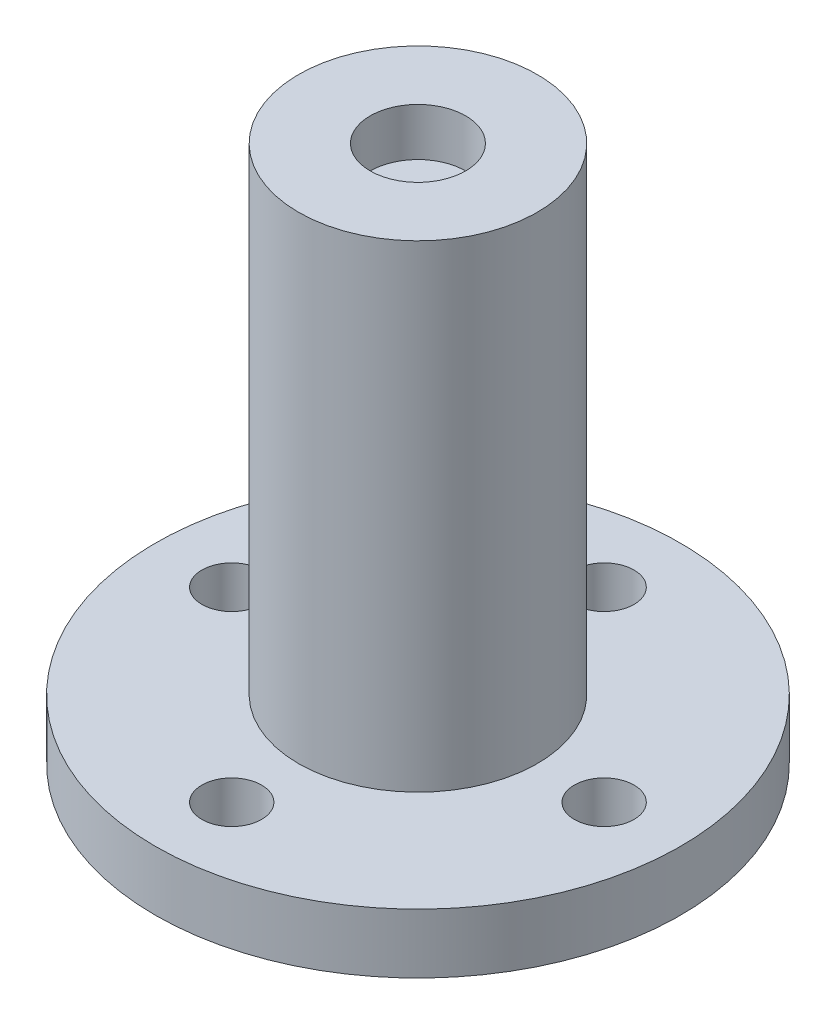
ISO-10303-21;
HEADER;
FILE_DESCRIPTION(('STEP AP214'),'2;1');
FILE_NAME('part.step','',(''),(''),'','','');
FILE_SCHEMA(('AUTOMOTIVE_DESIGN { 1 0 10303 214 1 1 1 1 }'));
ENDSEC;
DATA;
#1=APPLICATION_CONTEXT('core data for automotive mechanical design processes');
#2=APPLICATION_PROTOCOL_DEFINITION('international standard','automotive_design',2000,#1);
#3=PRODUCT_CONTEXT('',#1,'mechanical');
#4=PRODUCT('Part','Part','',(#3));
#5=PRODUCT_RELATED_PRODUCT_CATEGORY('part','',(#4));
#6=PRODUCT_DEFINITION_FORMATION('','',#4);
#7=PRODUCT_DEFINITION_CONTEXT('part definition',#1,'design');
#8=PRODUCT_DEFINITION('design','',#6,#7);
#9=PRODUCT_DEFINITION_SHAPE('','',#8);
#10=(LENGTH_UNIT() NAMED_UNIT(*) SI_UNIT(.MILLI.,.METRE.));
#11=(NAMED_UNIT(*) PLANE_ANGLE_UNIT() SI_UNIT($,.RADIAN.));
#12=(NAMED_UNIT(*) SI_UNIT($,.STERADIAN.) SOLID_ANGLE_UNIT());
#13=UNCERTAINTY_MEASURE_WITH_UNIT(LENGTH_MEASURE(1.E-05),#10,'distance_accuracy_value','');
#14=(GEOMETRIC_REPRESENTATION_CONTEXT(3) GLOBAL_UNCERTAINTY_ASSIGNED_CONTEXT((#13)) GLOBAL_UNIT_ASSIGNED_CONTEXT((#10,
#11,#12)) REPRESENTATION_CONTEXT('',''));
#15=CARTESIAN_POINT('',(0.,0.,0.));
#16=DIRECTION('',(0.,0.,1.));
#17=DIRECTION('',(1.,0.,0.));
#18=AXIS2_PLACEMENT_3D('',#15,#16,#17);
#19=CARTESIAN_POINT('',(0.,2.5,0.));
#20=DIRECTION('',(0.,1.,0.));
#21=DIRECTION('',(0.,0.,1.));
#22=AXIS2_PLACEMENT_3D('',#19,#20,#21);
#23=PLANE('',#22);
#24=CARTESIAN_POINT('',(0.,2.5,0.));
#25=DIRECTION('',(0.,1.,0.));
#26=DIRECTION('',(0.,0.,1.));
#27=AXIS2_PLACEMENT_3D('',#24,#25,#26);
#28=CIRCLE('',#27,5.);
#29=CARTESIAN_POINT('',(0.,2.5,5.));
#30=VERTEX_POINT('',#29);
#31=EDGE_CURVE('E70',#30,#30,#28,.T.);
#32=ORIENTED_EDGE('',*,*,#31,.F.);
#33=EDGE_LOOP('',(#32));
#34=FACE_BOUND('',#33,.T.);
#35=CARTESIAN_POINT('',(7.8,2.5,0.));
#36=DIRECTION('',(0.,1.,0.));
#37=DIRECTION('',(0.,0.,1.));
#38=AXIS2_PLACEMENT_3D('',#35,#36,#37);
#39=CIRCLE('',#38,1.25);
#40=CARTESIAN_POINT('',(7.8,2.5,1.25));
#41=VERTEX_POINT('',#40);
#42=EDGE_CURVE('E58',#41,#41,#39,.T.);
#43=ORIENTED_EDGE('',*,*,#42,.F.);
#44=EDGE_LOOP('',(#43));
#45=FACE_BOUND('',#44,.T.);
#46=CARTESIAN_POINT('',(-7.8,2.5,0.));
#47=DIRECTION('',(0.,1.,0.));
#48=DIRECTION('',(0.,0.,1.));
#49=AXIS2_PLACEMENT_3D('',#46,#47,#48);
#50=CIRCLE('',#49,1.25);
#51=CARTESIAN_POINT('',(-7.8,2.5,1.25));
#52=VERTEX_POINT('',#51);
#53=EDGE_CURVE('E47',#52,#52,#50,.T.);
#54=ORIENTED_EDGE('',*,*,#53,.F.);
#55=EDGE_LOOP('',(#54));
#56=FACE_BOUND('',#55,.T.);
#57=CARTESIAN_POINT('',(0.,2.5,0.));
#58=DIRECTION('',(0.,1.,0.));
#59=DIRECTION('',(0.,0.,1.));
#60=AXIS2_PLACEMENT_3D('',#57,#58,#59);
#61=CIRCLE('',#60,11.);
#62=CARTESIAN_POINT('',(0.,2.5,11.));
#63=VERTEX_POINT('',#62);
#64=EDGE_CURVE('E38',#63,#63,#61,.T.);
#65=ORIENTED_EDGE('',*,*,#64,.T.);
#66=EDGE_LOOP('',(#65));
#67=FACE_BOUND('',#66,.T.);
#68=CARTESIAN_POINT('',(0.,2.5,-7.8));
#69=DIRECTION('',(0.,1.,0.));
#70=DIRECTION('',(0.,0.,1.));
#71=AXIS2_PLACEMENT_3D('',#68,#69,#70);
#72=CIRCLE('',#71,1.25);
#73=CARTESIAN_POINT('',(0.,2.5,-6.55));
#74=VERTEX_POINT('',#73);
#75=EDGE_CURVE('E52',#74,#74,#72,.T.);
#76=ORIENTED_EDGE('',*,*,#75,.F.);
#77=EDGE_LOOP('',(#76));
#78=FACE_BOUND('',#77,.T.);
#79=CARTESIAN_POINT('',(0.,2.5,7.8));
#80=DIRECTION('',(0.,1.,0.));
#81=DIRECTION('',(0.,0.,1.));
#82=AXIS2_PLACEMENT_3D('',#79,#80,#81);
#83=CIRCLE('',#82,1.25);
#84=CARTESIAN_POINT('',(0.,2.5,9.05));
#85=VERTEX_POINT('',#84);
#86=EDGE_CURVE('E64',#85,#85,#83,.T.);
#87=ORIENTED_EDGE('',*,*,#86,.F.);
#88=EDGE_LOOP('',(#87));
#89=FACE_BOUND('',#88,.T.);
#90=ADVANCED_FACE('F31',(#34,#45,#56,#67,#78,#89),#23,.T.);
#91=CARTESIAN_POINT('',(0.,0.,0.));
#92=DIRECTION('',(0.,1.,0.));
#93=DIRECTION('',(0.,0.,1.));
#94=AXIS2_PLACEMENT_3D('',#91,#92,#93);
#95=PLANE('',#94);
#96=CARTESIAN_POINT('',(0.,0.,0.));
#97=DIRECTION('',(0.,1.,0.));
#98=DIRECTION('',(0.,0.,1.));
#99=AXIS2_PLACEMENT_3D('',#96,#97,#98);
#100=CIRCLE('',#99,11.);
#101=CARTESIAN_POINT('',(0.,0.,11.));
#102=VERTEX_POINT('',#101);
#103=EDGE_CURVE('E42',#102,#102,#100,.T.);
#104=ORIENTED_EDGE('',*,*,#103,.F.);
#105=EDGE_LOOP('',(#104));
#106=FACE_BOUND('',#105,.T.);
#107=CARTESIAN_POINT('',(-7.8,0.,0.));
#108=DIRECTION('',(0.,1.,0.));
#109=DIRECTION('',(0.,0.,1.));
#110=AXIS2_PLACEMENT_3D('',#107,#108,#109);
#111=CIRCLE('',#110,1.25);
#112=CARTESIAN_POINT('',(-7.8,0.,1.25));
#113=VERTEX_POINT('',#112);
#114=EDGE_CURVE('E49',#113,#113,#111,.T.);
#115=ORIENTED_EDGE('',*,*,#114,.T.);
#116=EDGE_LOOP('',(#115));
#117=FACE_BOUND('',#116,.T.);
#118=CARTESIAN_POINT('',(0.,0.,-7.8));
#119=DIRECTION('',(0.,1.,0.));
#120=DIRECTION('',(0.,0.,1.));
#121=AXIS2_PLACEMENT_3D('',#118,#119,#120);
#122=CIRCLE('',#121,1.25);
#123=CARTESIAN_POINT('',(0.,0.,-6.55));
#124=VERTEX_POINT('',#123);
#125=EDGE_CURVE('E55',#124,#124,#122,.T.);
#126=ORIENTED_EDGE('',*,*,#125,.T.);
#127=EDGE_LOOP('',(#126));
#128=FACE_BOUND('',#127,.T.);
#129=CARTESIAN_POINT('',(7.8,0.,0.));
#130=DIRECTION('',(0.,1.,0.));
#131=DIRECTION('',(0.,0.,1.));
#132=AXIS2_PLACEMENT_3D('',#129,#130,#131);
#133=CIRCLE('',#132,1.25);
#134=CARTESIAN_POINT('',(7.8,0.,1.25));
#135=VERTEX_POINT('',#134);
#136=EDGE_CURVE('E61',#135,#135,#133,.T.);
#137=ORIENTED_EDGE('',*,*,#136,.T.);
#138=EDGE_LOOP('',(#137));
#139=FACE_BOUND('',#138,.T.);
#140=CARTESIAN_POINT('',(0.,0.,7.8));
#141=DIRECTION('',(0.,1.,0.));
#142=DIRECTION('',(0.,0.,1.));
#143=AXIS2_PLACEMENT_3D('',#140,#141,#142);
#144=CIRCLE('',#143,1.25);
#145=CARTESIAN_POINT('',(0.,0.,9.05));
#146=VERTEX_POINT('',#145);
#147=EDGE_CURVE('E67',#146,#146,#144,.T.);
#148=ORIENTED_EDGE('',*,*,#147,.T.);
#149=EDGE_LOOP('',(#148));
#150=FACE_BOUND('',#149,.T.);
#151=ADVANCED_FACE('F100',(#106,#117,#128,#139,#150),#95,.F.);
#152=CARTESIAN_POINT('',(0.,2.5,0.));
#153=DIRECTION('',(0.,-1.,0.));
#154=DIRECTION('',(0.,0.,-1.));
#155=AXIS2_PLACEMENT_3D('',#152,#153,#154);
#156=CYLINDRICAL_SURFACE('',#155,11.);
#157=ORIENTED_EDGE('',*,*,#64,.F.);
#158=EDGE_LOOP('',(#157));
#159=FACE_BOUND('',#158,.T.);
#160=ORIENTED_EDGE('',*,*,#103,.T.);
#161=EDGE_LOOP('',(#160));
#162=FACE_BOUND('',#161,.T.);
#163=ADVANCED_FACE('F33',(#159,#162),#156,.T.);
#164=CARTESIAN_POINT('',(-7.8,2.5,0.));
#165=DIRECTION('',(0.,-1.,0.));
#166=DIRECTION('',(0.,0.,-1.));
#167=AXIS2_PLACEMENT_3D('',#164,#165,#166);
#168=CYLINDRICAL_SURFACE('',#167,1.25);
#169=ORIENTED_EDGE('',*,*,#53,.T.);
#170=EDGE_LOOP('',(#169));
#171=FACE_BOUND('',#170,.T.);
#172=ORIENTED_EDGE('',*,*,#114,.F.);
#173=EDGE_LOOP('',(#172));
#174=FACE_BOUND('',#173,.T.);
#175=ADVANCED_FACE('F110',(#171,#174),#168,.F.);
#176=CARTESIAN_POINT('',(0.,2.5,-7.8));
#177=DIRECTION('',(0.,-1.,0.));
#178=DIRECTION('',(0.,0.,-1.));
#179=AXIS2_PLACEMENT_3D('',#176,#177,#178);
#180=CYLINDRICAL_SURFACE('',#179,1.25);
#181=ORIENTED_EDGE('',*,*,#75,.T.);
#182=EDGE_LOOP('',(#181));
#183=FACE_BOUND('',#182,.T.);
#184=ORIENTED_EDGE('',*,*,#125,.F.);
#185=EDGE_LOOP('',(#184));
#186=FACE_BOUND('',#185,.T.);
#187=ADVANCED_FACE('F113',(#183,#186),#180,.F.);
#188=CARTESIAN_POINT('',(7.8,2.5,0.));
#189=DIRECTION('',(0.,-1.,0.));
#190=DIRECTION('',(0.,0.,-1.));
#191=AXIS2_PLACEMENT_3D('',#188,#189,#190);
#192=CYLINDRICAL_SURFACE('',#191,1.25);
#193=ORIENTED_EDGE('',*,*,#42,.T.);
#194=EDGE_LOOP('',(#193));
#195=FACE_BOUND('',#194,.T.);
#196=ORIENTED_EDGE('',*,*,#136,.F.);
#197=EDGE_LOOP('',(#196));
#198=FACE_BOUND('',#197,.T.);
#199=ADVANCED_FACE('F117',(#195,#198),#192,.F.);
#200=CARTESIAN_POINT('',(0.,2.5,7.8));
#201=DIRECTION('',(0.,-1.,0.));
#202=DIRECTION('',(0.,0.,-1.));
#203=AXIS2_PLACEMENT_3D('',#200,#201,#202);
#204=CYLINDRICAL_SURFACE('',#203,1.25);
#205=ORIENTED_EDGE('',*,*,#86,.T.);
#206=EDGE_LOOP('',(#205));
#207=FACE_BOUND('',#206,.T.);
#208=ORIENTED_EDGE('',*,*,#147,.F.);
#209=EDGE_LOOP('',(#208));
#210=FACE_BOUND('',#209,.T.);
#211=ADVANCED_FACE('F95',(#207,#210),#204,.F.);
#212=CARTESIAN_POINT('',(0.,20.5,0.));
#213=DIRECTION('',(0.,-1.,0.));
#214=DIRECTION('',(0.,0.,-1.));
#215=AXIS2_PLACEMENT_3D('',#212,#213,#214);
#216=CYLINDRICAL_SURFACE('',#215,5.);
#217=ORIENTED_EDGE('',*,*,#31,.T.);
#218=EDGE_LOOP('',(#217));
#219=FACE_BOUND('',#218,.T.);
#220=CARTESIAN_POINT('',(0.,22.5,0.));
#221=DIRECTION('',(0.,1.,0.));
#222=DIRECTION('',(0.,0.,1.));
#223=AXIS2_PLACEMENT_3D('',#220,#221,#222);
#224=CIRCLE('',#223,5.);
#225=CARTESIAN_POINT('',(0.,22.5,5.));
#226=VERTEX_POINT('',#225);
#227=EDGE_CURVE('E75',#226,#226,#224,.T.);
#228=ORIENTED_EDGE('',*,*,#227,.F.);
#229=EDGE_LOOP('',(#228));
#230=FACE_BOUND('',#229,.T.);
#231=ADVANCED_FACE('F86',(#219,#230),#216,.T.);
#232=CARTESIAN_POINT('',(0.,22.5,0.));
#233=DIRECTION('',(0.,1.,0.));
#234=DIRECTION('',(0.,0.,1.));
#235=AXIS2_PLACEMENT_3D('',#232,#233,#234);
#236=PLANE('',#235);
#237=ORIENTED_EDGE('',*,*,#227,.T.);
#238=EDGE_LOOP('',(#237));
#239=FACE_BOUND('',#238,.T.);
#240=CARTESIAN_POINT('',(0.,22.5,0.));
#241=DIRECTION('',(0.,1.,0.));
#242=DIRECTION('',(0.,0.,1.));
#243=AXIS2_PLACEMENT_3D('',#240,#241,#242);
#244=CIRCLE('',#243,2.);
#245=CARTESIAN_POINT('',(0.,22.5,2.));
#246=VERTEX_POINT('',#245);
#247=EDGE_CURVE('E78',#246,#246,#244,.T.);
#248=ORIENTED_EDGE('',*,*,#247,.F.);
#249=EDGE_LOOP('',(#248));
#250=FACE_BOUND('',#249,.T.);
#251=ADVANCED_FACE('F84',(#239,#250),#236,.T.);
#252=CARTESIAN_POINT('',(0.,22.5,0.));
#253=DIRECTION('',(0.,-1.,0.));
#254=DIRECTION('',(0.,0.,-1.));
#255=AXIS2_PLACEMENT_3D('',#252,#253,#254);
#256=CYLINDRICAL_SURFACE('',#255,2.);
#257=ORIENTED_EDGE('',*,*,#247,.T.);
#258=EDGE_LOOP('',(#257));
#259=FACE_BOUND('',#258,.T.);
#260=CARTESIAN_POINT('',(0.,20.5,0.));
#261=DIRECTION('',(0.,1.,0.));
#262=DIRECTION('',(0.,0.,1.));
#263=AXIS2_PLACEMENT_3D('',#260,#261,#262);
#264=CIRCLE('',#263,2.);
#265=CARTESIAN_POINT('',(0.,20.5,2.));
#266=VERTEX_POINT('',#265);
#267=EDGE_CURVE('E10',#266,#266,#264,.F.);
#268=ORIENTED_EDGE('',*,*,#267,.T.);
#269=EDGE_LOOP('',(#268));
#270=FACE_BOUND('',#269,.T.);
#271=ADVANCED_FACE('F82',(#259,#270),#256,.F.);
#272=CARTESIAN_POINT('',(0.,20.5,0.));
#273=DIRECTION('',(0.,1.,0.));
#274=DIRECTION('',(0.,0.,1.));
#275=AXIS2_PLACEMENT_3D('',#272,#273,#274);
#276=PLANE('',#275);
#277=ORIENTED_EDGE('',*,*,#267,.F.);
#278=EDGE_LOOP('',(#277));
#279=FACE_BOUND('',#278,.T.);
#280=ADVANCED_FACE('F93',(#279),#276,.T.);
#281=CLOSED_SHELL('',(#90,#151,#163,#175,#187,#199,#211,#231,#251,#271,#280));
#282=MANIFOLD_SOLID_BREP('B2',#281);
#283=ADVANCED_BREP_SHAPE_REPRESENTATION('',(#18,#282),#14);
#284=SHAPE_DEFINITION_REPRESENTATION(#9,#283);
ENDSEC;
END-ISO-10303-21;
